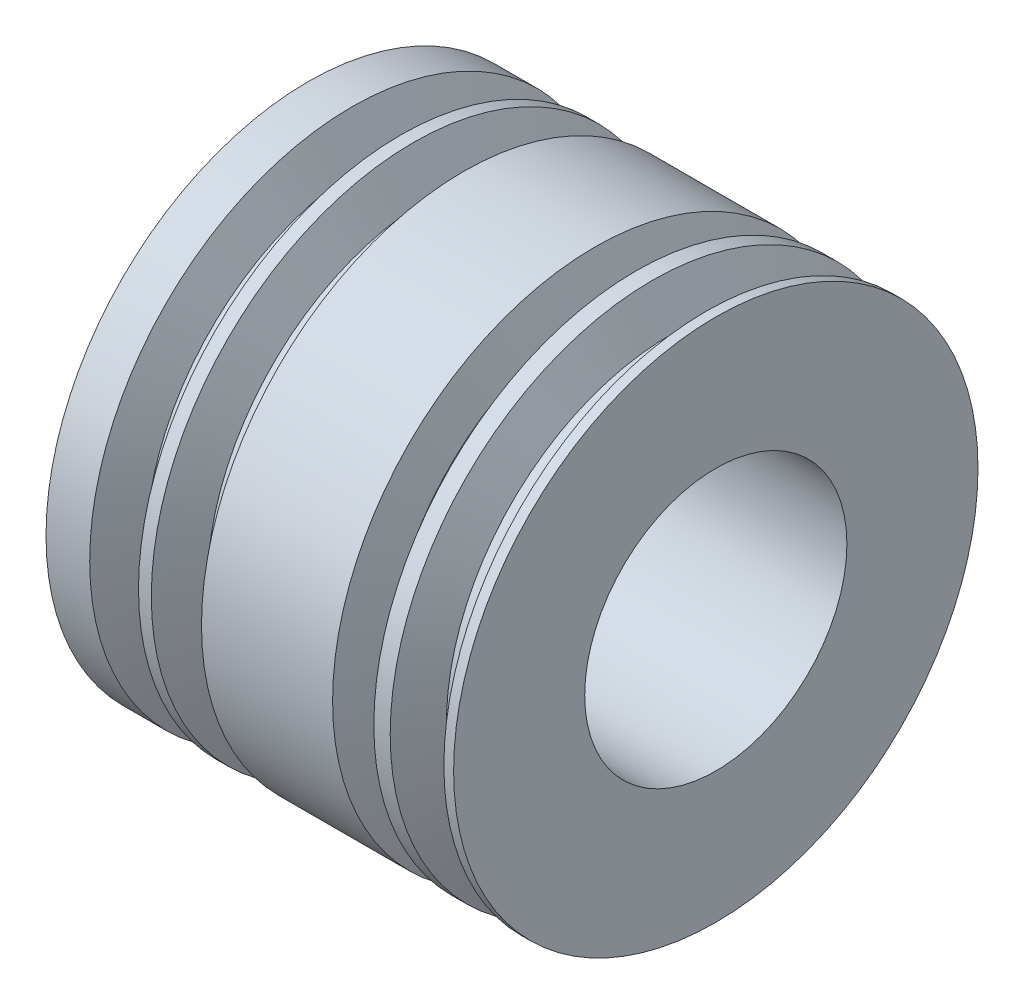
ISO-10303-21;
HEADER;
FILE_DESCRIPTION(('STEP AP214'),'2;1');
FILE_NAME('part.step','',(''),(''),'','','');
FILE_SCHEMA(('AUTOMOTIVE_DESIGN { 1 0 10303 214 1 1 1 1 }'));
ENDSEC;
DATA;
#1=APPLICATION_CONTEXT('core data for automotive mechanical design processes');
#2=APPLICATION_PROTOCOL_DEFINITION('international standard','automotive_design',2000,#1);
#3=PRODUCT_CONTEXT('',#1,'mechanical');
#4=PRODUCT('Part','Part','',(#3));
#5=PRODUCT_RELATED_PRODUCT_CATEGORY('part','',(#4));
#6=PRODUCT_DEFINITION_FORMATION('','',#4);
#7=PRODUCT_DEFINITION_CONTEXT('part definition',#1,'design');
#8=PRODUCT_DEFINITION('design','',#6,#7);
#9=PRODUCT_DEFINITION_SHAPE('','',#8);
#10=(LENGTH_UNIT() NAMED_UNIT(*) SI_UNIT(.MILLI.,.METRE.));
#11=(NAMED_UNIT(*) PLANE_ANGLE_UNIT() SI_UNIT($,.RADIAN.));
#12=(NAMED_UNIT(*) SI_UNIT($,.STERADIAN.) SOLID_ANGLE_UNIT());
#13=UNCERTAINTY_MEASURE_WITH_UNIT(LENGTH_MEASURE(1.E-05),#10,'distance_accuracy_value','');
#14=(GEOMETRIC_REPRESENTATION_CONTEXT(3) GLOBAL_UNCERTAINTY_ASSIGNED_CONTEXT((#13)) GLOBAL_UNIT_ASSIGNED_CONTEXT((#10,
#11,#12)) REPRESENTATION_CONTEXT('',''));
#15=CARTESIAN_POINT('',(0.,0.,0.));
#16=DIRECTION('',(0.,0.,1.));
#17=DIRECTION('',(1.,0.,0.));
#18=AXIS2_PLACEMENT_3D('',#15,#16,#17);
#19=CARTESIAN_POINT('',(-2.12720346074092,-3.,0.));
#20=DIRECTION('',(-1.,0.,0.));
#21=DIRECTION('',(0.,0.,1.));
#22=AXIS2_PLACEMENT_3D('',#19,#20,#21);
#23=CONICAL_SURFACE('',#22,5.13264515565664,1.22288391818355);
#24=CARTESIAN_POINT('',(-2.441762305189,-3.,0.));
#25=DIRECTION('',(1.,0.,0.));
#26=DIRECTION('',(0.,0.,-1.));
#27=AXIS2_PLACEMENT_3D('',#24,#25,#26);
#28=CIRCLE('',#27,6.);
#29=CARTESIAN_POINT('',(-2.441762305189,-3.,-6.));
#30=VERTEX_POINT('',#29);
#31=EDGE_CURVE('E10',#30,#30,#28,.T.);
#32=ORIENTED_EDGE('',*,*,#31,.T.);
#33=EDGE_LOOP('',(#32));
#34=FACE_BOUND('',#33,.T.);
#35=CARTESIAN_POINT('',(-2.12720346074092,-3.,0.));
#36=DIRECTION('',(1.,0.,0.));
#37=DIRECTION('',(0.,0.,-1.));
#38=AXIS2_PLACEMENT_3D('',#35,#36,#37);
#39=CIRCLE('',#38,5.13264515565664);
#40=CARTESIAN_POINT('',(-2.12720346074092,-3.,-5.13264515565664));
#41=VERTEX_POINT('',#40);
#42=EDGE_CURVE('E103',#41,#41,#39,.T.);
#43=ORIENTED_EDGE('',*,*,#42,.F.);
#44=EDGE_LOOP('',(#43));
#45=FACE_BOUND('',#44,.T.);
#46=ADVANCED_FACE('F39',(#34,#45),#23,.T.);
#47=CARTESIAN_POINT('',(0.327556569141859,-3.,0.));
#48=DIRECTION('',(1.,0.,0.));
#49=DIRECTION('',(0.,0.,-1.));
#50=AXIS2_PLACEMENT_3D('',#47,#48,#49);
#51=CYLINDRICAL_SURFACE('',#50,6.);
#52=CARTESIAN_POINT('',(-5.441762305189,-3.,0.));
#53=DIRECTION('',(1.,0.,0.));
#54=DIRECTION('',(0.,0.,-1.));
#55=AXIS2_PLACEMENT_3D('',#52,#53,#54);
#56=CIRCLE('',#55,6.);
#57=CARTESIAN_POINT('',(-5.441762305189,-3.,-6.));
#58=VERTEX_POINT('',#57);
#59=EDGE_CURVE('E45',#58,#58,#56,.T.);
#60=ORIENTED_EDGE('',*,*,#59,.T.);
#61=EDGE_LOOP('',(#60));
#62=FACE_BOUND('',#61,.T.);
#63=ORIENTED_EDGE('',*,*,#31,.F.);
#64=EDGE_LOOP('',(#63));
#65=FACE_BOUND('',#64,.T.);
#66=ADVANCED_FACE('F111',(#62,#65),#51,.T.);
#67=CARTESIAN_POINT('',(-5.907929964468,-3.,0.));
#68=DIRECTION('',(1.,0.,0.));
#69=DIRECTION('',(0.,0.,-1.));
#70=AXIS2_PLACEMENT_3D('',#67,#68,#69);
#71=CONICAL_SURFACE('',#70,5.13264515565663,1.07763248751491);
#72=ORIENTED_EDGE('',*,*,#59,.F.);
#73=EDGE_LOOP('',(#72));
#74=FACE_BOUND('',#73,.T.);
#75=CARTESIAN_POINT('',(-5.907929964468,-3.,0.));
#76=DIRECTION('',(1.,0.,0.));
#77=DIRECTION('',(0.,0.,-1.));
#78=AXIS2_PLACEMENT_3D('',#75,#76,#77);
#79=CIRCLE('',#78,5.13264515565663);
#80=CARTESIAN_POINT('',(-5.907929964468,-3.,-5.13264515565663));
#81=VERTEX_POINT('',#80);
#82=EDGE_CURVE('E49',#81,#81,#79,.T.);
#83=ORIENTED_EDGE('',*,*,#82,.T.);
#84=EDGE_LOOP('',(#83));
#85=FACE_BOUND('',#84,.T.);
#86=ADVANCED_FACE('F115',(#74,#85),#71,.T.);
#87=CARTESIAN_POINT('',(0.327556569141859,-3.,0.));
#88=DIRECTION('',(1.,0.,0.));
#89=DIRECTION('',(0.,0.,-1.));
#90=AXIS2_PLACEMENT_3D('',#87,#88,#89);
#91=CYLINDRICAL_SURFACE('',#90,5.13264515565663);
#92=ORIENTED_EDGE('',*,*,#82,.F.);
#93=EDGE_LOOP('',(#92));
#94=FACE_BOUND('',#93,.T.);
#95=CARTESIAN_POINT('',(-6.17640762981161,-3.,0.));
#96=DIRECTION('',(1.,0.,0.));
#97=DIRECTION('',(0.,0.,-1.));
#98=AXIS2_PLACEMENT_3D('',#95,#96,#97);
#99=CIRCLE('',#98,5.13264515565663);
#100=CARTESIAN_POINT('',(-6.17640762981161,-3.,-5.13264515565663));
#101=VERTEX_POINT('',#100);
#102=EDGE_CURVE('E53',#101,#101,#99,.T.);
#103=ORIENTED_EDGE('',*,*,#102,.T.);
#104=EDGE_LOOP('',(#103));
#105=FACE_BOUND('',#104,.T.);
#106=ADVANCED_FACE('F119',(#94,#105),#91,.T.);
#107=CARTESIAN_POINT('',(-6.58999367579052,-3.,0.));
#108=DIRECTION('',(-1.,0.,0.));
#109=DIRECTION('',(0.,0.,1.));
#110=AXIS2_PLACEMENT_3D('',#107,#108,#109);
#111=CONICAL_SURFACE('',#110,6.,1.12585101591865);
#112=ORIENTED_EDGE('',*,*,#102,.F.);
#113=EDGE_LOOP('',(#112));
#114=FACE_BOUND('',#113,.T.);
#115=CARTESIAN_POINT('',(-6.58999367579052,-3.,0.));
#116=DIRECTION('',(1.,0.,0.));
#117=DIRECTION('',(0.,0.,-1.));
#118=AXIS2_PLACEMENT_3D('',#115,#116,#117);
#119=CIRCLE('',#118,6.);
#120=CARTESIAN_POINT('',(-6.58999367579052,-3.,-6.));
#121=VERTEX_POINT('',#120);
#122=EDGE_CURVE('E58',#121,#121,#119,.T.);
#123=ORIENTED_EDGE('',*,*,#122,.T.);
#124=EDGE_LOOP('',(#123));
#125=FACE_BOUND('',#124,.T.);
#126=ADVANCED_FACE('F126',(#114,#125),#111,.T.);
#127=CARTESIAN_POINT('',(0.327556569141859,-3.,0.));
#128=DIRECTION('',(1.,0.,0.));
#129=DIRECTION('',(0.,0.,-1.));
#130=AXIS2_PLACEMENT_3D('',#127,#128,#129);
#131=CYLINDRICAL_SURFACE('',#130,6.);
#132=ORIENTED_EDGE('',*,*,#122,.F.);
#133=EDGE_LOOP('',(#132));
#134=FACE_BOUND('',#133,.T.);
#135=CARTESIAN_POINT('',(-6.88371736376055,-3.,0.));
#136=DIRECTION('',(1.,0.,0.));
#137=DIRECTION('',(0.,0.,-1.));
#138=AXIS2_PLACEMENT_3D('',#135,#136,#137);
#139=CIRCLE('',#138,6.);
#140=CARTESIAN_POINT('',(-6.88371736376055,-3.,-6.));
#141=VERTEX_POINT('',#140);
#142=EDGE_CURVE('E61',#141,#141,#139,.T.);
#143=ORIENTED_EDGE('',*,*,#142,.T.);
#144=EDGE_LOOP('',(#143));
#145=FACE_BOUND('',#144,.T.);
#146=ADVANCED_FACE('F130',(#134,#145),#131,.T.);
#147=CARTESIAN_POINT('',(-7.36371377541705,-3.,0.));
#148=DIRECTION('',(1.,0.,0.));
#149=DIRECTION('',(0.,0.,-1.));
#150=AXIS2_PLACEMENT_3D('',#147,#148,#149);
#151=CONICAL_SURFACE('',#150,5.13264515565663,1.06534452163463);
#152=ORIENTED_EDGE('',*,*,#142,.F.);
#153=EDGE_LOOP('',(#152));
#154=FACE_BOUND('',#153,.T.);
#155=CARTESIAN_POINT('',(-7.36371377541705,-3.,0.));
#156=DIRECTION('',(1.,0.,0.));
#157=DIRECTION('',(0.,0.,-1.));
#158=AXIS2_PLACEMENT_3D('',#155,#156,#157);
#159=CIRCLE('',#158,5.13264515565663);
#160=CARTESIAN_POINT('',(-7.36371377541705,-3.,-5.13264515565663));
#161=VERTEX_POINT('',#160);
#162=EDGE_CURVE('E64',#161,#161,#159,.T.);
#163=ORIENTED_EDGE('',*,*,#162,.T.);
#164=EDGE_LOOP('',(#163));
#165=FACE_BOUND('',#164,.T.);
#166=ADVANCED_FACE('F134',(#154,#165),#151,.T.);
#167=CARTESIAN_POINT('',(0.327556569141859,-3.,0.));
#168=DIRECTION('',(1.,0.,0.));
#169=DIRECTION('',(0.,0.,-1.));
#170=AXIS2_PLACEMENT_3D('',#167,#168,#169);
#171=CYLINDRICAL_SURFACE('',#170,5.13264515565663);
#172=ORIENTED_EDGE('',*,*,#162,.F.);
#173=EDGE_LOOP('',(#172));
#174=FACE_BOUND('',#173,.T.);
#175=CARTESIAN_POINT('',(-7.58641395402109,-3.,0.));
#176=DIRECTION('',(1.,0.,0.));
#177=DIRECTION('',(0.,0.,-1.));
#178=AXIS2_PLACEMENT_3D('',#175,#176,#177);
#179=CIRCLE('',#178,5.13264515565663);
#180=CARTESIAN_POINT('',(-7.58641395402109,-3.,-5.13264515565663));
#181=VERTEX_POINT('',#180);
#182=EDGE_CURVE('E67',#181,#181,#179,.T.);
#183=ORIENTED_EDGE('',*,*,#182,.T.);
#184=EDGE_LOOP('',(#183));
#185=FACE_BOUND('',#184,.T.);
#186=ADVANCED_FACE('F138',(#174,#185),#171,.T.);
#187=CARTESIAN_POINT('',(-8.,-3.,0.));
#188=DIRECTION('',(-1.,0.,0.));
#189=DIRECTION('',(0.,0.,1.));
#190=AXIS2_PLACEMENT_3D('',#187,#188,#189);
#191=CONICAL_SURFACE('',#190,6.,1.12585101591865);
#192=ORIENTED_EDGE('',*,*,#182,.F.);
#193=EDGE_LOOP('',(#192));
#194=FACE_BOUND('',#193,.T.);
#195=CARTESIAN_POINT('',(-8.,-3.,0.));
#196=DIRECTION('',(1.,0.,0.));
#197=DIRECTION('',(0.,0.,-1.));
#198=AXIS2_PLACEMENT_3D('',#195,#196,#197);
#199=CIRCLE('',#198,6.);
#200=CARTESIAN_POINT('',(-8.,-3.,-6.));
#201=VERTEX_POINT('',#200);
#202=EDGE_CURVE('E70',#201,#201,#199,.T.);
#203=ORIENTED_EDGE('',*,*,#202,.T.);
#204=EDGE_LOOP('',(#203));
#205=FACE_BOUND('',#204,.T.);
#206=ADVANCED_FACE('F142',(#194,#205),#191,.T.);
#207=CARTESIAN_POINT('',(0.327556569141859,-3.,0.));
#208=DIRECTION('',(1.,0.,0.));
#209=DIRECTION('',(0.,0.,-1.));
#210=AXIS2_PLACEMENT_3D('',#207,#208,#209);
#211=CYLINDRICAL_SURFACE('',#210,6.);
#212=ORIENTED_EDGE('',*,*,#202,.F.);
#213=EDGE_LOOP('',(#212));
#214=FACE_BOUND('',#213,.T.);
#215=CARTESIAN_POINT('',(-9.,-3.,0.));
#216=DIRECTION('',(1.,0.,0.));
#217=DIRECTION('',(0.,0.,-1.));
#218=AXIS2_PLACEMENT_3D('',#215,#216,#217);
#219=CIRCLE('',#218,6.);
#220=CARTESIAN_POINT('',(-9.,-3.,-6.));
#221=VERTEX_POINT('',#220);
#222=EDGE_CURVE('E73',#221,#221,#219,.T.);
#223=ORIENTED_EDGE('',*,*,#222,.T.);
#224=EDGE_LOOP('',(#223));
#225=FACE_BOUND('',#224,.T.);
#226=ADVANCED_FACE('F146',(#214,#225),#211,.T.);
#227=CARTESIAN_POINT('',(-9.,0.,0.));
#228=DIRECTION('',(1.,0.,0.));
#229=DIRECTION('',(0.,0.,-1.));
#230=AXIS2_PLACEMENT_3D('',#227,#228,#229);
#231=PLANE('',#230);
#232=ORIENTED_EDGE('',*,*,#222,.F.);
#233=EDGE_LOOP('',(#232));
#234=FACE_BOUND('',#233,.T.);
#235=CARTESIAN_POINT('',(-9.,-3.,0.));
#236=DIRECTION('',(1.,0.,0.));
#237=DIRECTION('',(0.,0.,-1.));
#238=AXIS2_PLACEMENT_3D('',#235,#236,#237);
#239=CIRCLE('',#238,3.);
#240=CARTESIAN_POINT('',(-9.,-3.,-3.));
#241=VERTEX_POINT('',#240);
#242=EDGE_CURVE('E76',#241,#241,#239,.T.);
#243=ORIENTED_EDGE('',*,*,#242,.T.);
#244=EDGE_LOOP('',(#243));
#245=FACE_BOUND('',#244,.T.);
#246=ADVANCED_FACE('F150',(#234,#245),#231,.F.);
#247=CARTESIAN_POINT('',(0.327556569141859,-3.,0.));
#248=DIRECTION('',(1.,0.,0.));
#249=DIRECTION('',(0.,0.,-1.));
#250=AXIS2_PLACEMENT_3D('',#247,#248,#249);
#251=CYLINDRICAL_SURFACE('',#250,3.);
#252=ORIENTED_EDGE('',*,*,#242,.F.);
#253=EDGE_LOOP('',(#252));
#254=FACE_BOUND('',#253,.T.);
#255=CARTESIAN_POINT('',(0.327556569141859,-3.,0.));
#256=DIRECTION('',(1.,0.,0.));
#257=DIRECTION('',(0.,0.,-1.));
#258=AXIS2_PLACEMENT_3D('',#255,#256,#257);
#259=CIRCLE('',#258,3.);
#260=CARTESIAN_POINT('',(0.327556569141859,-3.,-3.));
#261=VERTEX_POINT('',#260);
#262=EDGE_CURVE('E79',#261,#261,#259,.T.);
#263=ORIENTED_EDGE('',*,*,#262,.T.);
#264=EDGE_LOOP('',(#263));
#265=FACE_BOUND('',#264,.T.);
#266=ADVANCED_FACE('F154',(#254,#265),#251,.F.);
#267=CARTESIAN_POINT('',(0.327556569141858,0.,0.));
#268=DIRECTION('',(-1.,0.,0.));
#269=DIRECTION('',(0.,0.,1.));
#270=AXIS2_PLACEMENT_3D('',#267,#268,#269);
#271=PLANE('',#270);
#272=ORIENTED_EDGE('',*,*,#262,.F.);
#273=EDGE_LOOP('',(#272));
#274=FACE_BOUND('',#273,.T.);
#275=CARTESIAN_POINT('',(0.327556569141858,-3.,0.));
#276=DIRECTION('',(1.,0.,0.));
#277=DIRECTION('',(0.,0.,-1.));
#278=AXIS2_PLACEMENT_3D('',#275,#276,#277);
#279=CIRCLE('',#278,6.);
#280=CARTESIAN_POINT('',(0.327556569141858,-3.,-6.));
#281=VERTEX_POINT('',#280);
#282=EDGE_CURVE('E82',#281,#281,#279,.T.);
#283=ORIENTED_EDGE('',*,*,#282,.T.);
#284=EDGE_LOOP('',(#283));
#285=FACE_BOUND('',#284,.T.);
#286=ADVANCED_FACE('F158',(#274,#285),#271,.F.);
#287=CARTESIAN_POINT('',(0.327556569141859,-3.,0.));
#288=DIRECTION('',(1.,0.,0.));
#289=DIRECTION('',(0.,0.,-1.));
#290=AXIS2_PLACEMENT_3D('',#287,#288,#289);
#291=CYLINDRICAL_SURFACE('',#290,6.);
#292=ORIENTED_EDGE('',*,*,#282,.F.);
#293=EDGE_LOOP('',(#292));
#294=FACE_BOUND('',#293,.T.);
#295=CARTESIAN_POINT('',(0.104856390537825,-3.,0.));
#296=DIRECTION('',(1.,0.,0.));
#297=DIRECTION('',(0.,0.,-1.));
#298=AXIS2_PLACEMENT_3D('',#295,#296,#297);
#299=CIRCLE('',#298,6.);
#300=CARTESIAN_POINT('',(0.104856390537825,-3.,-6.));
#301=VERTEX_POINT('',#300);
#302=EDGE_CURVE('E85',#301,#301,#299,.T.);
#303=ORIENTED_EDGE('',*,*,#302,.T.);
#304=EDGE_LOOP('',(#303));
#305=FACE_BOUND('',#304,.T.);
#306=ADVANCED_FACE('F162',(#294,#305),#291,.T.);
#307=CARTESIAN_POINT('',(-0.177610190541052,-3.,0.));
#308=DIRECTION('',(1.,0.,0.));
#309=DIRECTION('',(0.,0.,-1.));
#310=AXIS2_PLACEMENT_3D('',#307,#308,#309);
#311=CONICAL_SURFACE('',#310,5.13264515565664,1.25596363252432);
#312=ORIENTED_EDGE('',*,*,#302,.F.);
#313=EDGE_LOOP('',(#312));
#314=FACE_BOUND('',#313,.T.);
#315=CARTESIAN_POINT('',(-0.177610190541052,-3.,0.));
#316=DIRECTION('',(1.,0.,0.));
#317=DIRECTION('',(0.,0.,-1.));
#318=AXIS2_PLACEMENT_3D('',#315,#316,#317);
#319=CIRCLE('',#318,5.13264515565664);
#320=CARTESIAN_POINT('',(-0.177610190541052,-3.,-5.13264515565664));
#321=VERTEX_POINT('',#320);
#322=EDGE_CURVE('E88',#321,#321,#319,.T.);
#323=ORIENTED_EDGE('',*,*,#322,.T.);
#324=EDGE_LOOP('',(#323));
#325=FACE_BOUND('',#324,.T.);
#326=ADVANCED_FACE('F166',(#314,#325),#311,.T.);
#327=CARTESIAN_POINT('',(0.327556569141859,-3.,0.));
#328=DIRECTION('',(1.,0.,0.));
#329=DIRECTION('',(0.,0.,-1.));
#330=AXIS2_PLACEMENT_3D('',#327,#328,#329);
#331=CYLINDRICAL_SURFACE('',#330,5.13264515565664);
#332=CARTESIAN_POINT('',(-0.704199164428205,-3.,0.));
#333=DIRECTION('',(1.,0.,0.));
#334=DIRECTION('',(0.,0.,-1.));
#335=AXIS2_PLACEMENT_3D('',#332,#333,#334);
#336=CIRCLE('',#335,5.13264515565664);
#337=CARTESIAN_POINT('',(-0.704199164428205,-3.,-5.13264515565664));
#338=VERTEX_POINT('',#337);
#339=EDGE_CURVE('E91',#338,#338,#336,.T.);
#340=ORIENTED_EDGE('',*,*,#339,.T.);
#341=EDGE_LOOP('',(#340));
#342=FACE_BOUND('',#341,.T.);
#343=ORIENTED_EDGE('',*,*,#322,.F.);
#344=EDGE_LOOP('',(#343));
#345=FACE_BOUND('',#344,.T.);
#346=ADVANCED_FACE('F170',(#342,#345),#331,.T.);
#347=CARTESIAN_POINT('',(-0.704199164428205,-3.,0.));
#348=DIRECTION('',(-1.,0.,0.));
#349=DIRECTION('',(0.,0.,1.));
#350=AXIS2_PLACEMENT_3D('',#347,#348,#349);
#351=CONICAL_SURFACE('',#350,5.13264515565664,1.12039290628028);
#352=CARTESIAN_POINT('',(-1.12361095702564,-3.,0.));
#353=DIRECTION('',(1.,0.,0.));
#354=DIRECTION('',(0.,0.,-1.));
#355=AXIS2_PLACEMENT_3D('',#352,#353,#354);
#356=CIRCLE('',#355,6.00000000000001);
#357=CARTESIAN_POINT('',(-1.12361095702564,-3.,-6.00000000000001));
#358=VERTEX_POINT('',#357);
#359=EDGE_CURVE('E94',#358,#358,#356,.T.);
#360=ORIENTED_EDGE('',*,*,#359,.T.);
#361=EDGE_LOOP('',(#360));
#362=FACE_BOUND('',#361,.T.);
#363=ORIENTED_EDGE('',*,*,#339,.F.);
#364=EDGE_LOOP('',(#363));
#365=FACE_BOUND('',#364,.T.);
#366=ADVANCED_FACE('F174',(#362,#365),#351,.T.);
#367=CARTESIAN_POINT('',(0.327556569141859,-3.,0.));
#368=DIRECTION('',(1.,0.,0.));
#369=DIRECTION('',(0.,0.,-1.));
#370=AXIS2_PLACEMENT_3D('',#367,#368,#369);
#371=CYLINDRICAL_SURFACE('',#370,6.00000000000001);
#372=CARTESIAN_POINT('',(-1.49808577184478,-3.,0.));
#373=DIRECTION('',(1.,0.,0.));
#374=DIRECTION('',(0.,0.,-1.));
#375=AXIS2_PLACEMENT_3D('',#372,#373,#374);
#376=CIRCLE('',#375,6.00000000000001);
#377=CARTESIAN_POINT('',(-1.49808577184478,-3.,-6.00000000000001));
#378=VERTEX_POINT('',#377);
#379=EDGE_CURVE('E97',#378,#378,#376,.T.);
#380=ORIENTED_EDGE('',*,*,#379,.T.);
#381=EDGE_LOOP('',(#380));
#382=FACE_BOUND('',#381,.T.);
#383=ORIENTED_EDGE('',*,*,#359,.F.);
#384=EDGE_LOOP('',(#383));
#385=FACE_BOUND('',#384,.T.);
#386=ADVANCED_FACE('F178',(#382,#385),#371,.T.);
#387=CARTESIAN_POINT('',(-1.49808577184478,-3.,0.));
#388=DIRECTION('',(1.,0.,0.));
#389=DIRECTION('',(0.,0.,-1.));
#390=AXIS2_PLACEMENT_3D('',#387,#388,#389);
#391=CONICAL_SURFACE('',#390,6.00000000000001,1.22480387901812);
#392=CARTESIAN_POINT('',(-1.81076160992749,-3.,0.));
#393=DIRECTION('',(1.,0.,0.));
#394=DIRECTION('',(0.,0.,-1.));
#395=AXIS2_PLACEMENT_3D('',#392,#393,#394);
#396=CIRCLE('',#395,5.13264515565664);
#397=CARTESIAN_POINT('',(-1.81076160992749,-3.,-5.13264515565664));
#398=VERTEX_POINT('',#397);
#399=EDGE_CURVE('E100',#398,#398,#396,.T.);
#400=ORIENTED_EDGE('',*,*,#399,.T.);
#401=EDGE_LOOP('',(#400));
#402=FACE_BOUND('',#401,.T.);
#403=ORIENTED_EDGE('',*,*,#379,.F.);
#404=EDGE_LOOP('',(#403));
#405=FACE_BOUND('',#404,.T.);
#406=ADVANCED_FACE('F182',(#402,#405),#391,.T.);
#407=CARTESIAN_POINT('',(0.327556569141859,-3.,0.));
#408=DIRECTION('',(1.,0.,0.));
#409=DIRECTION('',(0.,0.,-1.));
#410=AXIS2_PLACEMENT_3D('',#407,#408,#409);
#411=CYLINDRICAL_SURFACE('',#410,5.13264515565664);
#412=ORIENTED_EDGE('',*,*,#42,.T.);
#413=EDGE_LOOP('',(#412));
#414=FACE_BOUND('',#413,.T.);
#415=ORIENTED_EDGE('',*,*,#399,.F.);
#416=EDGE_LOOP('',(#415));
#417=FACE_BOUND('',#416,.T.);
#418=ADVANCED_FACE('F107',(#414,#417),#411,.T.);
#419=CLOSED_SHELL('',(#46,#66,#86,#106,#126,#146,#166,#186,#206,#226,#246,#266,#286,#306,#326,
#346,#366,#386,#406,#418));
#420=MANIFOLD_SOLID_BREP('B2',#419);
#421=ADVANCED_BREP_SHAPE_REPRESENTATION('',(#18,#420),#14);
#422=SHAPE_DEFINITION_REPRESENTATION(#9,#421);
ENDSEC;
END-ISO-10303-21;
